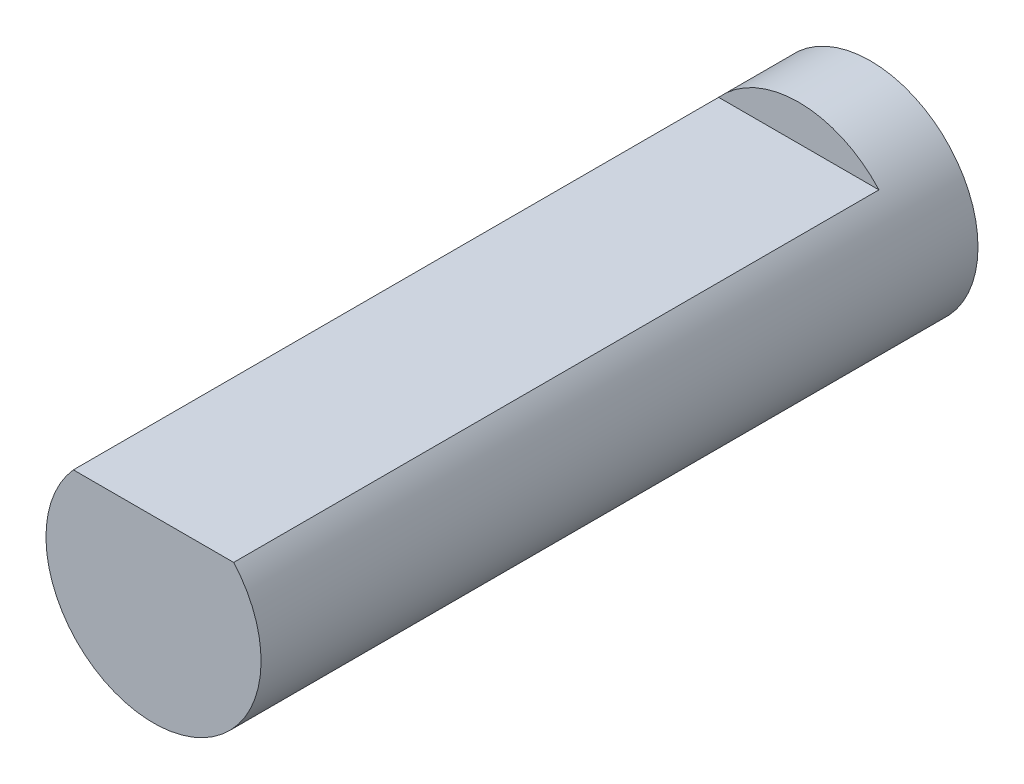
ISO-10303-21;
HEADER;
FILE_DESCRIPTION(('STEP AP214'),'2;1');
FILE_NAME('part.step','',(''),(''),'','','');
FILE_SCHEMA(('AUTOMOTIVE_DESIGN { 1 0 10303 214 1 1 1 1 }'));
ENDSEC;
DATA;
#1=APPLICATION_CONTEXT('core data for automotive mechanical design processes');
#2=APPLICATION_PROTOCOL_DEFINITION('international standard','automotive_design',2000,#1);
#3=PRODUCT_CONTEXT('',#1,'mechanical');
#4=PRODUCT('Part','Part','',(#3));
#5=PRODUCT_RELATED_PRODUCT_CATEGORY('part','',(#4));
#6=PRODUCT_DEFINITION_FORMATION('','',#4);
#7=PRODUCT_DEFINITION_CONTEXT('part definition',#1,'design');
#8=PRODUCT_DEFINITION('design','',#6,#7);
#9=PRODUCT_DEFINITION_SHAPE('','',#8);
#10=(LENGTH_UNIT() NAMED_UNIT(*) SI_UNIT(.MILLI.,.METRE.));
#11=(NAMED_UNIT(*) PLANE_ANGLE_UNIT() SI_UNIT($,.RADIAN.));
#12=(NAMED_UNIT(*) SI_UNIT($,.STERADIAN.) SOLID_ANGLE_UNIT());
#13=UNCERTAINTY_MEASURE_WITH_UNIT(LENGTH_MEASURE(1.E-05),#10,'distance_accuracy_value','');
#14=(GEOMETRIC_REPRESENTATION_CONTEXT(3) GLOBAL_UNCERTAINTY_ASSIGNED_CONTEXT((#13)) GLOBAL_UNIT_ASSIGNED_CONTEXT((#10,
#11,#12)) REPRESENTATION_CONTEXT('',''));
#15=CARTESIAN_POINT('',(0.,0.,0.));
#16=DIRECTION('',(0.,0.,1.));
#17=DIRECTION('',(1.,0.,0.));
#18=AXIS2_PLACEMENT_3D('',#15,#16,#17);
#19=CARTESIAN_POINT('',(0.,0.,10.));
#20=DIRECTION('',(0.,0.,-1.));
#21=DIRECTION('',(-1.,0.,0.));
#22=AXIS2_PLACEMENT_3D('',#19,#20,#21);
#23=CYLINDRICAL_SURFACE('',#22,1.5);
#24=CARTESIAN_POINT('',(0.,0.,10.));
#25=DIRECTION('',(0.,0.,1.));
#26=DIRECTION('',(1.,0.,0.));
#27=AXIS2_PLACEMENT_3D('',#24,#25,#26);
#28=CIRCLE('',#27,1.5);
#29=CARTESIAN_POINT('',(-1.1180339887499,1.,10.));
#30=VERTEX_POINT('',#29);
#31=CARTESIAN_POINT('',(1.1180339887499,1.,10.));
#32=VERTEX_POINT('',#31);
#33=EDGE_CURVE('E11',#30,#32,#28,.T.);
#34=ORIENTED_EDGE('',*,*,#33,.F.);
#35=DIRECTION('',(0.,0.,1.));
#36=VECTOR('',#35,1.);
#37=CARTESIAN_POINT('',(-1.1180339887499,1.,1.));
#38=LINE('',#37,#36);
#39=CARTESIAN_POINT('',(-1.1180339887499,1.,1.));
#40=VERTEX_POINT('',#39);
#41=EDGE_CURVE('E47',#40,#30,#38,.T.);
#42=ORIENTED_EDGE('',*,*,#41,.F.);
#43=CARTESIAN_POINT('',(0.,0.,1.));
#44=DIRECTION('',(0.,0.,1.));
#45=DIRECTION('',(-1.,0.,0.));
#46=AXIS2_PLACEMENT_3D('',#43,#44,#45);
#47=CIRCLE('',#46,1.5);
#48=CARTESIAN_POINT('',(1.1180339887499,1.,1.));
#49=VERTEX_POINT('',#48);
#50=EDGE_CURVE('E62',#49,#40,#47,.T.);
#51=ORIENTED_EDGE('',*,*,#50,.F.);
#52=DIRECTION('',(0.,0.,1.));
#53=VECTOR('',#52,1.);
#54=CARTESIAN_POINT('',(1.1180339887499,1.,1.));
#55=LINE('',#54,#53);
#56=EDGE_CURVE('E53',#49,#32,#55,.T.);
#57=ORIENTED_EDGE('',*,*,#56,.T.);
#58=EDGE_LOOP('',(#34,#42,#51,#57));
#59=FACE_BOUND('',#58,.T.);
#60=CARTESIAN_POINT('',(0.,0.,0.));
#61=DIRECTION('',(0.,0.,1.));
#62=DIRECTION('',(1.,0.,0.));
#63=AXIS2_PLACEMENT_3D('',#60,#61,#62);
#64=CIRCLE('',#63,1.5);
#65=CARTESIAN_POINT('',(1.5,0.,0.));
#66=VERTEX_POINT('',#65);
#67=EDGE_CURVE('E36',#66,#66,#64,.T.);
#68=ORIENTED_EDGE('',*,*,#67,.T.);
#69=EDGE_LOOP('',(#68));
#70=FACE_BOUND('',#69,.T.);
#71=ADVANCED_FACE('F33',(#59,#70),#23,.T.);
#72=CARTESIAN_POINT('',(0.,0.,10.));
#73=DIRECTION('',(0.,0.,1.));
#74=DIRECTION('',(1.,0.,0.));
#75=AXIS2_PLACEMENT_3D('',#72,#73,#74);
#76=PLANE('',#75);
#77=DIRECTION('',(1.,0.,0.));
#78=VECTOR('',#77,1.);
#79=CARTESIAN_POINT('',(-1.1180339887499,1.,10.));
#80=LINE('',#79,#78);
#81=EDGE_CURVE('E58',#30,#32,#80,.T.);
#82=ORIENTED_EDGE('',*,*,#81,.F.);
#83=ORIENTED_EDGE('',*,*,#33,.T.);
#84=EDGE_LOOP('',(#82,#83));
#85=FACE_BOUND('',#84,.T.);
#86=ADVANCED_FACE('F68',(#85),#76,.T.);
#87=CARTESIAN_POINT('',(0.,0.,0.));
#88=DIRECTION('',(0.,0.,1.));
#89=DIRECTION('',(1.,0.,0.));
#90=AXIS2_PLACEMENT_3D('',#87,#88,#89);
#91=PLANE('',#90);
#92=ORIENTED_EDGE('',*,*,#67,.F.);
#93=EDGE_LOOP('',(#92));
#94=FACE_BOUND('',#93,.T.);
#95=ADVANCED_FACE('F70',(#94),#91,.F.);
#96=CARTESIAN_POINT('',(-1.1180339887499,1.,1.));
#97=DIRECTION('',(0.,-1.,0.));
#98=DIRECTION('',(0.,0.,-1.));
#99=AXIS2_PLACEMENT_3D('',#96,#97,#98);
#100=PLANE('',#99);
#101=ORIENTED_EDGE('',*,*,#81,.T.);
#102=ORIENTED_EDGE('',*,*,#56,.F.);
#103=DIRECTION('',(1.,0.,0.));
#104=VECTOR('',#103,1.);
#105=CARTESIAN_POINT('',(-1.1180339887499,1.,1.));
#106=LINE('',#105,#104);
#107=EDGE_CURVE('E85',#40,#49,#106,.T.);
#108=ORIENTED_EDGE('',*,*,#107,.F.);
#109=ORIENTED_EDGE('',*,*,#41,.T.);
#110=EDGE_LOOP('',(#101,#102,#108,#109));
#111=FACE_BOUND('',#110,.T.);
#112=ADVANCED_FACE('F59',(#111),#100,.F.);
#113=CARTESIAN_POINT('',(0.,0.,1.));
#114=DIRECTION('',(0.,0.,-1.));
#115=DIRECTION('',(-1.,0.,0.));
#116=AXIS2_PLACEMENT_3D('',#113,#114,#115);
#117=PLANE('',#116);
#118=ORIENTED_EDGE('',*,*,#50,.T.);
#119=ORIENTED_EDGE('',*,*,#107,.T.);
#120=EDGE_LOOP('',(#118,#119));
#121=FACE_BOUND('',#120,.T.);
#122=ADVANCED_FACE('F80',(#121),#117,.F.);
#123=CLOSED_SHELL('',(#71,#86,#95,#112,#122));
#124=MANIFOLD_SOLID_BREP('B2',#123);
#125=ADVANCED_BREP_SHAPE_REPRESENTATION('',(#18,#124),#14);
#126=SHAPE_DEFINITION_REPRESENTATION(#9,#125);
ENDSEC;
END-ISO-10303-21;
